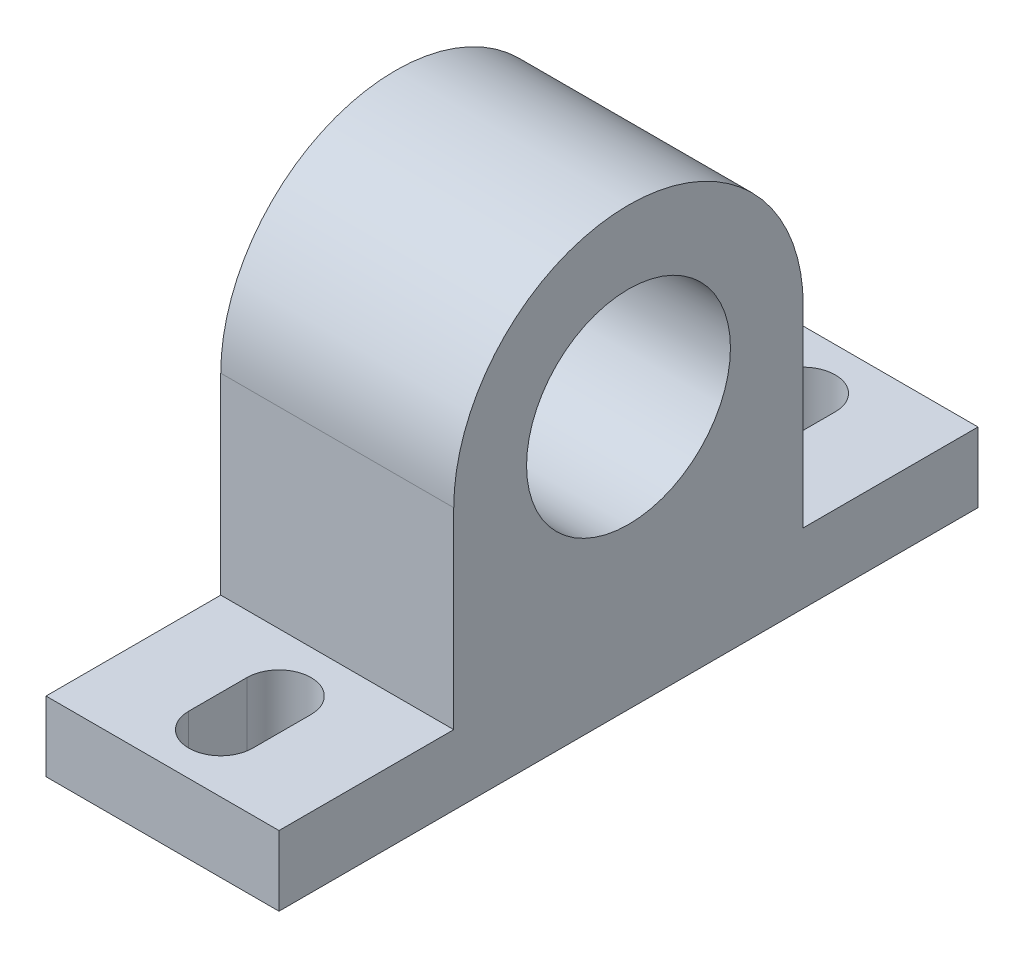
ISO-10303-21;
HEADER;
FILE_DESCRIPTION(('STEP AP214'),'2;1');
FILE_NAME('part.step','',(''),(''),'','','');
FILE_SCHEMA(('AUTOMOTIVE_DESIGN { 1 0 10303 214 1 1 1 1 }'));
ENDSEC;
DATA;
#1=APPLICATION_CONTEXT('core data for automotive mechanical design processes');
#2=APPLICATION_PROTOCOL_DEFINITION('international standard','automotive_design',2000,#1);
#3=PRODUCT_CONTEXT('',#1,'mechanical');
#4=PRODUCT('Part','Part','',(#3));
#5=PRODUCT_RELATED_PRODUCT_CATEGORY('part','',(#4));
#6=PRODUCT_DEFINITION_FORMATION('','',#4);
#7=PRODUCT_DEFINITION_CONTEXT('part definition',#1,'design');
#8=PRODUCT_DEFINITION('design','',#6,#7);
#9=PRODUCT_DEFINITION_SHAPE('','',#8);
#10=(LENGTH_UNIT() NAMED_UNIT(*) SI_UNIT(.MILLI.,.METRE.));
#11=(NAMED_UNIT(*) PLANE_ANGLE_UNIT() SI_UNIT($,.RADIAN.));
#12=(NAMED_UNIT(*) SI_UNIT($,.STERADIAN.) SOLID_ANGLE_UNIT());
#13=UNCERTAINTY_MEASURE_WITH_UNIT(LENGTH_MEASURE(1.E-05),#10,'distance_accuracy_value','');
#14=(GEOMETRIC_REPRESENTATION_CONTEXT(3) GLOBAL_UNCERTAINTY_ASSIGNED_CONTEXT((#13)) GLOBAL_UNIT_ASSIGNED_CONTEXT((#10,
#11,#12)) REPRESENTATION_CONTEXT('',''));
#15=CARTESIAN_POINT('',(0.,0.,0.));
#16=DIRECTION('',(0.,0.,1.));
#17=DIRECTION('',(1.,0.,0.));
#18=AXIS2_PLACEMENT_3D('',#15,#16,#17);
#19=CARTESIAN_POINT('',(0.,12.,0.));
#20=DIRECTION('',(0.,-1.,0.));
#21=DIRECTION('',(0.,0.,-1.));
#22=AXIS2_PLACEMENT_3D('',#19,#20,#21);
#23=PLANE('',#22);
#24=DIRECTION('',(0.,0.,1.));
#25=VECTOR('',#24,1.);
#26=CARTESIAN_POINT('',(-5.5,12.,-40.));
#27=LINE('',#26,#25);
#28=CARTESIAN_POINT('',(-5.5,12.,-50.));
#29=VERTEX_POINT('',#28);
#30=CARTESIAN_POINT('',(-5.5,12.,-40.));
#31=VERTEX_POINT('',#30);
#32=EDGE_CURVE('E241',#29,#31,#27,.T.);
#33=ORIENTED_EDGE('',*,*,#32,.F.);
#34=CARTESIAN_POINT('',(0.,12.,-50.));
#35=DIRECTION('',(0.,1.,0.));
#36=DIRECTION('',(0.,0.,-1.));
#37=AXIS2_PLACEMENT_3D('',#34,#35,#36);
#38=CIRCLE('',#37,5.5);
#39=CARTESIAN_POINT('',(5.5,12.,-50.));
#40=VERTEX_POINT('',#39);
#41=EDGE_CURVE('E69',#40,#29,#38,.T.);
#42=ORIENTED_EDGE('',*,*,#41,.F.);
#43=DIRECTION('',(0.,0.,-1.));
#44=VECTOR('',#43,1.);
#45=CARTESIAN_POINT('',(5.5,12.,-50.));
#46=LINE('',#45,#44);
#47=CARTESIAN_POINT('',(5.5,12.,-40.));
#48=VERTEX_POINT('',#47);
#49=EDGE_CURVE('E232',#48,#40,#46,.T.);
#50=ORIENTED_EDGE('',*,*,#49,.F.);
#51=CARTESIAN_POINT('',(0.,12.,-40.));
#52=DIRECTION('',(0.,1.,0.));
#53=DIRECTION('',(0.,0.,-1.));
#54=AXIS2_PLACEMENT_3D('',#51,#52,#53);
#55=CIRCLE('',#54,5.5);
#56=EDGE_CURVE('E236',#31,#48,#55,.T.);
#57=ORIENTED_EDGE('',*,*,#56,.F.);
#58=EDGE_LOOP('',(#33,#42,#50,#57));
#59=FACE_BOUND('',#58,.T.);
#60=DIRECTION('',(-1.,0.,0.));
#61=VECTOR('',#60,1.);
#62=CARTESIAN_POINT('',(0.,12.,-30.));
#63=LINE('',#62,#61);
#64=CARTESIAN_POINT('',(20.,12.,-30.));
#65=VERTEX_POINT('',#64);
#66=CARTESIAN_POINT('',(-20.,12.,-30.));
#67=VERTEX_POINT('',#66);
#68=EDGE_CURVE('E11',#65,#67,#63,.T.);
#69=ORIENTED_EDGE('',*,*,#68,.F.);
#70=DIRECTION('',(0.,0.,-1.));
#71=VECTOR('',#70,1.);
#72=CARTESIAN_POINT('',(20.,12.,-60.));
#73=LINE('',#72,#71);
#74=CARTESIAN_POINT('',(20.,12.,-60.));
#75=VERTEX_POINT('',#74);
#76=EDGE_CURVE('E301',#65,#75,#73,.T.);
#77=ORIENTED_EDGE('',*,*,#76,.T.);
#78=DIRECTION('',(-1.,0.,0.));
#79=VECTOR('',#78,1.);
#80=CARTESIAN_POINT('',(-20.,12.,-60.));
#81=LINE('',#80,#79);
#82=CARTESIAN_POINT('',(-20.,12.,-60.));
#83=VERTEX_POINT('',#82);
#84=EDGE_CURVE('E305',#75,#83,#81,.T.);
#85=ORIENTED_EDGE('',*,*,#84,.T.);
#86=DIRECTION('',(0.,0.,1.));
#87=VECTOR('',#86,1.);
#88=CARTESIAN_POINT('',(-20.,12.,60.));
#89=LINE('',#88,#87);
#90=EDGE_CURVE('E294',#83,#67,#89,.T.);
#91=ORIENTED_EDGE('',*,*,#90,.T.);
#92=EDGE_LOOP('',(#69,#77,#85,#91));
#93=FACE_BOUND('',#92,.T.);
#94=ADVANCED_FACE('F51',(#59,#93),#23,.F.);
#95=DIRECTION('',(0.,0.,1.));
#96=VECTOR('',#95,1.);
#97=CARTESIAN_POINT('',(-5.5,12.,50.));
#98=LINE('',#97,#96);
#99=CARTESIAN_POINT('',(-5.5,12.,40.));
#100=VERTEX_POINT('',#99);
#101=CARTESIAN_POINT('',(-5.5,12.,50.));
#102=VERTEX_POINT('',#101);
#103=EDGE_CURVE('E206',#100,#102,#98,.T.);
#104=ORIENTED_EDGE('',*,*,#103,.F.);
#105=CARTESIAN_POINT('',(0.,12.,40.));
#106=DIRECTION('',(0.,1.,0.));
#107=DIRECTION('',(0.,0.,-1.));
#108=AXIS2_PLACEMENT_3D('',#105,#106,#107);
#109=CIRCLE('',#108,5.5);
#110=CARTESIAN_POINT('',(5.5,12.,40.));
#111=VERTEX_POINT('',#110);
#112=EDGE_CURVE('E77',#111,#100,#109,.T.);
#113=ORIENTED_EDGE('',*,*,#112,.F.);
#114=DIRECTION('',(0.,0.,-1.));
#115=VECTOR('',#114,1.);
#116=CARTESIAN_POINT('',(5.5,12.,40.));
#117=LINE('',#116,#115);
#118=CARTESIAN_POINT('',(5.5,12.,50.));
#119=VERTEX_POINT('',#118);
#120=EDGE_CURVE('E191',#119,#111,#117,.T.);
#121=ORIENTED_EDGE('',*,*,#120,.F.);
#122=CARTESIAN_POINT('',(0.,12.,50.));
#123=DIRECTION('',(0.,1.,0.));
#124=DIRECTION('',(0.,0.,-1.));
#125=AXIS2_PLACEMENT_3D('',#122,#123,#124);
#126=CIRCLE('',#125,5.5);
#127=EDGE_CURVE('E197',#102,#119,#126,.T.);
#128=ORIENTED_EDGE('',*,*,#127,.F.);
#129=EDGE_LOOP('',(#104,#113,#121,#128));
#130=FACE_BOUND('',#129,.T.);
#131=DIRECTION('',(1.,0.,0.));
#132=VECTOR('',#131,1.);
#133=CARTESIAN_POINT('',(0.,12.,30.));
#134=LINE('',#133,#132);
#135=CARTESIAN_POINT('',(-20.,12.,30.));
#136=VERTEX_POINT('',#135);
#137=CARTESIAN_POINT('',(20.,12.,30.));
#138=VERTEX_POINT('',#137);
#139=EDGE_CURVE('E62',#136,#138,#134,.T.);
#140=ORIENTED_EDGE('',*,*,#139,.F.);
#141=CARTESIAN_POINT('',(-20.,12.,60.));
#142=VERTEX_POINT('',#141);
#143=EDGE_CURVE('E298',#136,#142,#89,.T.);
#144=ORIENTED_EDGE('',*,*,#143,.T.);
#145=DIRECTION('',(1.,0.,0.));
#146=VECTOR('',#145,1.);
#147=CARTESIAN_POINT('',(20.,12.,60.));
#148=LINE('',#147,#146);
#149=CARTESIAN_POINT('',(20.,12.,60.));
#150=VERTEX_POINT('',#149);
#151=EDGE_CURVE('E297',#142,#150,#148,.T.);
#152=ORIENTED_EDGE('',*,*,#151,.T.);
#153=EDGE_CURVE('E302',#150,#138,#73,.T.);
#154=ORIENTED_EDGE('',*,*,#153,.T.);
#155=EDGE_LOOP('',(#140,#144,#152,#154));
#156=FACE_BOUND('',#155,.T.);
#157=ADVANCED_FACE('F383',(#130,#156),#23,.F.);
#158=CARTESIAN_POINT('',(-20.,12.,60.));
#159=DIRECTION('',(1.,0.,0.));
#160=DIRECTION('',(0.,0.,-1.));
#161=AXIS2_PLACEMENT_3D('',#158,#159,#160);
#162=PLANE('',#161);
#163=CARTESIAN_POINT('',(-20.,45.,0.));
#164=DIRECTION('',(1.,0.,0.));
#165=DIRECTION('',(0.,0.,-1.));
#166=AXIS2_PLACEMENT_3D('',#163,#164,#165);
#167=CIRCLE('',#166,17.5);
#168=CARTESIAN_POINT('',(-20.,45.,-17.5));
#169=VERTEX_POINT('',#168);
#170=EDGE_CURVE('E261',#169,#169,#167,.T.);
#171=ORIENTED_EDGE('',*,*,#170,.T.);
#172=EDGE_LOOP('',(#171));
#173=FACE_BOUND('',#172,.T.);
#174=DIRECTION('',(0.,1.,0.));
#175=VECTOR('',#174,1.);
#176=CARTESIAN_POINT('',(-20.,10.,-30.));
#177=LINE('',#176,#175);
#178=CARTESIAN_POINT('',(-20.,45.,-30.));
#179=VERTEX_POINT('',#178);
#180=EDGE_CURVE('E265',#67,#179,#177,.T.);
#181=ORIENTED_EDGE('',*,*,#180,.F.);
#182=ORIENTED_EDGE('',*,*,#90,.F.);
#183=DIRECTION('',(0.,-1.,0.));
#184=VECTOR('',#183,1.);
#185=CARTESIAN_POINT('',(-20.,12.,-60.));
#186=LINE('',#185,#184);
#187=CARTESIAN_POINT('',(-20.,0.,-60.));
#188=VERTEX_POINT('',#187);
#189=EDGE_CURVE('E308',#83,#188,#186,.T.);
#190=ORIENTED_EDGE('',*,*,#189,.T.);
#191=DIRECTION('',(0.,0.,1.));
#192=VECTOR('',#191,1.);
#193=CARTESIAN_POINT('',(-20.,0.,60.));
#194=LINE('',#193,#192);
#195=CARTESIAN_POINT('',(-20.,0.,60.));
#196=VERTEX_POINT('',#195);
#197=EDGE_CURVE('E293',#188,#196,#194,.T.);
#198=ORIENTED_EDGE('',*,*,#197,.T.);
#199=DIRECTION('',(0.,-1.,0.));
#200=VECTOR('',#199,1.);
#201=CARTESIAN_POINT('',(-20.,12.,60.));
#202=LINE('',#201,#200);
#203=EDGE_CURVE('E331',#142,#196,#202,.T.);
#204=ORIENTED_EDGE('',*,*,#203,.F.);
#205=ORIENTED_EDGE('',*,*,#143,.F.);
#206=DIRECTION('',(0.,-1.,0.));
#207=VECTOR('',#206,1.);
#208=CARTESIAN_POINT('',(-20.,45.,30.));
#209=LINE('',#208,#207);
#210=CARTESIAN_POINT('',(-20.,45.,30.));
#211=VERTEX_POINT('',#210);
#212=EDGE_CURVE('E270',#211,#136,#209,.T.);
#213=ORIENTED_EDGE('',*,*,#212,.F.);
#214=CARTESIAN_POINT('',(-20.,45.,0.));
#215=DIRECTION('',(1.,0.,0.));
#216=DIRECTION('',(0.,0.,-1.));
#217=AXIS2_PLACEMENT_3D('',#214,#215,#216);
#218=CIRCLE('',#217,30.);
#219=EDGE_CURVE('E280',#179,#211,#218,.T.);
#220=ORIENTED_EDGE('',*,*,#219,.F.);
#221=EDGE_LOOP('',(#181,#182,#190,#198,#204,#205,#213,#220));
#222=FACE_BOUND('',#221,.T.);
#223=ADVANCED_FACE('F54',(#173,#222),#162,.F.);
#224=CARTESIAN_POINT('',(20.,12.,60.));
#225=DIRECTION('',(0.,0.,-1.));
#226=DIRECTION('',(-1.,0.,0.));
#227=AXIS2_PLACEMENT_3D('',#224,#225,#226);
#228=PLANE('',#227);
#229=DIRECTION('',(1.,0.,0.));
#230=VECTOR('',#229,1.);
#231=CARTESIAN_POINT('',(20.,0.,60.));
#232=LINE('',#231,#230);
#233=CARTESIAN_POINT('',(20.,0.,60.));
#234=VERTEX_POINT('',#233);
#235=EDGE_CURVE('E311',#196,#234,#232,.T.);
#236=ORIENTED_EDGE('',*,*,#235,.T.);
#237=DIRECTION('',(0.,-1.,0.));
#238=VECTOR('',#237,1.);
#239=CARTESIAN_POINT('',(20.,12.,60.));
#240=LINE('',#239,#238);
#241=EDGE_CURVE('E327',#150,#234,#240,.T.);
#242=ORIENTED_EDGE('',*,*,#241,.F.);
#243=ORIENTED_EDGE('',*,*,#151,.F.);
#244=ORIENTED_EDGE('',*,*,#203,.T.);
#245=EDGE_LOOP('',(#236,#242,#243,#244));
#246=FACE_BOUND('',#245,.T.);
#247=ADVANCED_FACE('F398',(#246),#228,.F.);
#248=CARTESIAN_POINT('',(20.,12.,-60.));
#249=DIRECTION('',(-1.,0.,0.));
#250=DIRECTION('',(0.,0.,1.));
#251=AXIS2_PLACEMENT_3D('',#248,#249,#250);
#252=PLANE('',#251);
#253=CARTESIAN_POINT('',(20.,45.,0.));
#254=DIRECTION('',(-1.,0.,0.));
#255=DIRECTION('',(0.,0.,1.));
#256=AXIS2_PLACEMENT_3D('',#253,#254,#255);
#257=CIRCLE('',#256,17.5);
#258=CARTESIAN_POINT('',(20.,45.,17.5));
#259=VERTEX_POINT('',#258);
#260=EDGE_CURVE('E56',#259,#259,#257,.T.);
#261=ORIENTED_EDGE('',*,*,#260,.T.);
#262=EDGE_LOOP('',(#261));
#263=FACE_BOUND('',#262,.T.);
#264=ORIENTED_EDGE('',*,*,#76,.F.);
#265=DIRECTION('',(0.,1.,0.));
#266=VECTOR('',#265,1.);
#267=CARTESIAN_POINT('',(20.,10.,-30.));
#268=LINE('',#267,#266);
#269=CARTESIAN_POINT('',(20.,45.,-30.));
#270=VERTEX_POINT('',#269);
#271=EDGE_CURVE('E266',#65,#270,#268,.T.);
#272=ORIENTED_EDGE('',*,*,#271,.T.);
#273=CARTESIAN_POINT('',(20.,45.,0.));
#274=DIRECTION('',(1.,0.,0.));
#275=DIRECTION('',(0.,0.,-1.));
#276=AXIS2_PLACEMENT_3D('',#273,#274,#275);
#277=CIRCLE('',#276,30.);
#278=CARTESIAN_POINT('',(20.,45.,30.));
#279=VERTEX_POINT('',#278);
#280=EDGE_CURVE('E269',#270,#279,#277,.T.);
#281=ORIENTED_EDGE('',*,*,#280,.T.);
#282=DIRECTION('',(0.,-1.,0.));
#283=VECTOR('',#282,1.);
#284=CARTESIAN_POINT('',(20.,45.,30.));
#285=LINE('',#284,#283);
#286=EDGE_CURVE('E273',#279,#138,#285,.T.);
#287=ORIENTED_EDGE('',*,*,#286,.T.);
#288=ORIENTED_EDGE('',*,*,#153,.F.);
#289=ORIENTED_EDGE('',*,*,#241,.T.);
#290=DIRECTION('',(0.,0.,-1.));
#291=VECTOR('',#290,1.);
#292=CARTESIAN_POINT('',(20.,0.,-60.));
#293=LINE('',#292,#291);
#294=CARTESIAN_POINT('',(20.,0.,-60.));
#295=VERTEX_POINT('',#294);
#296=EDGE_CURVE('E314',#234,#295,#293,.T.);
#297=ORIENTED_EDGE('',*,*,#296,.T.);
#298=DIRECTION('',(0.,-1.,0.));
#299=VECTOR('',#298,1.);
#300=CARTESIAN_POINT('',(20.,12.,-60.));
#301=LINE('',#300,#299);
#302=EDGE_CURVE('E323',#75,#295,#301,.T.);
#303=ORIENTED_EDGE('',*,*,#302,.F.);
#304=EDGE_LOOP('',(#264,#272,#281,#287,#288,#289,#297,#303));
#305=FACE_BOUND('',#304,.T.);
#306=ADVANCED_FACE('F346',(#263,#305),#252,.F.);
#307=CARTESIAN_POINT('',(-20.,12.,-60.));
#308=DIRECTION('',(0.,0.,1.));
#309=DIRECTION('',(1.,0.,0.));
#310=AXIS2_PLACEMENT_3D('',#307,#308,#309);
#311=PLANE('',#310);
#312=DIRECTION('',(-1.,0.,0.));
#313=VECTOR('',#312,1.);
#314=CARTESIAN_POINT('',(-20.,0.,-60.));
#315=LINE('',#314,#313);
#316=EDGE_CURVE('E317',#295,#188,#315,.T.);
#317=ORIENTED_EDGE('',*,*,#316,.T.);
#318=ORIENTED_EDGE('',*,*,#189,.F.);
#319=ORIENTED_EDGE('',*,*,#84,.F.);
#320=ORIENTED_EDGE('',*,*,#302,.T.);
#321=EDGE_LOOP('',(#317,#318,#319,#320));
#322=FACE_BOUND('',#321,.T.);
#323=ADVANCED_FACE('F367',(#322),#311,.F.);
#324=CARTESIAN_POINT('',(0.,0.,0.));
#325=DIRECTION('',(0.,-1.,0.));
#326=DIRECTION('',(0.,0.,-1.));
#327=AXIS2_PLACEMENT_3D('',#324,#325,#326);
#328=PLANE('',#327);
#329=CARTESIAN_POINT('',(0.,0.,40.));
#330=DIRECTION('',(0.,1.,0.));
#331=DIRECTION('',(0.,0.,-1.));
#332=AXIS2_PLACEMENT_3D('',#329,#330,#331);
#333=CIRCLE('',#332,5.5);
#334=CARTESIAN_POINT('',(5.5,0.,40.));
#335=VERTEX_POINT('',#334);
#336=CARTESIAN_POINT('',(-5.5,0.,40.));
#337=VERTEX_POINT('',#336);
#338=EDGE_CURVE('E169',#335,#337,#333,.T.);
#339=ORIENTED_EDGE('',*,*,#338,.T.);
#340=DIRECTION('',(0.,0.,1.));
#341=VECTOR('',#340,1.);
#342=CARTESIAN_POINT('',(-5.5,0.,50.));
#343=LINE('',#342,#341);
#344=CARTESIAN_POINT('',(-5.5,0.,50.));
#345=VERTEX_POINT('',#344);
#346=EDGE_CURVE('E180',#337,#345,#343,.T.);
#347=ORIENTED_EDGE('',*,*,#346,.T.);
#348=CARTESIAN_POINT('',(0.,0.,50.));
#349=DIRECTION('',(0.,1.,0.));
#350=DIRECTION('',(0.,0.,-1.));
#351=AXIS2_PLACEMENT_3D('',#348,#349,#350);
#352=CIRCLE('',#351,5.5);
#353=CARTESIAN_POINT('',(5.5,0.,50.));
#354=VERTEX_POINT('',#353);
#355=EDGE_CURVE('E185',#345,#354,#352,.T.);
#356=ORIENTED_EDGE('',*,*,#355,.T.);
#357=DIRECTION('',(0.,0.,-1.));
#358=VECTOR('',#357,1.);
#359=CARTESIAN_POINT('',(5.5,0.,40.));
#360=LINE('',#359,#358);
#361=EDGE_CURVE('E176',#354,#335,#360,.T.);
#362=ORIENTED_EDGE('',*,*,#361,.T.);
#363=EDGE_LOOP('',(#339,#347,#356,#362));
#364=FACE_BOUND('',#363,.T.);
#365=CARTESIAN_POINT('',(0.,0.,-50.));
#366=DIRECTION('',(0.,1.,0.));
#367=DIRECTION('',(0.,0.,-1.));
#368=AXIS2_PLACEMENT_3D('',#365,#366,#367);
#369=CIRCLE('',#368,5.5);
#370=CARTESIAN_POINT('',(5.5,0.,-50.));
#371=VERTEX_POINT('',#370);
#372=CARTESIAN_POINT('',(-5.5,0.,-50.));
#373=VERTEX_POINT('',#372);
#374=EDGE_CURVE('E237',#371,#373,#369,.T.);
#375=ORIENTED_EDGE('',*,*,#374,.T.);
#376=DIRECTION('',(0.,0.,1.));
#377=VECTOR('',#376,1.);
#378=CARTESIAN_POINT('',(-5.5,0.,-40.));
#379=LINE('',#378,#377);
#380=CARTESIAN_POINT('',(-5.5,0.,-40.));
#381=VERTEX_POINT('',#380);
#382=EDGE_CURVE('E254',#373,#381,#379,.T.);
#383=ORIENTED_EDGE('',*,*,#382,.T.);
#384=CARTESIAN_POINT('',(0.,0.,-40.));
#385=DIRECTION('',(0.,1.,0.));
#386=DIRECTION('',(0.,0.,-1.));
#387=AXIS2_PLACEMENT_3D('',#384,#385,#386);
#388=CIRCLE('',#387,5.5);
#389=CARTESIAN_POINT('',(5.5,0.,-40.));
#390=VERTEX_POINT('',#389);
#391=EDGE_CURVE('E250',#381,#390,#388,.T.);
#392=ORIENTED_EDGE('',*,*,#391,.T.);
#393=DIRECTION('',(0.,0.,-1.));
#394=VECTOR('',#393,1.);
#395=CARTESIAN_POINT('',(5.5,0.,-50.));
#396=LINE('',#395,#394);
#397=EDGE_CURVE('E222',#390,#371,#396,.T.);
#398=ORIENTED_EDGE('',*,*,#397,.T.);
#399=EDGE_LOOP('',(#375,#383,#392,#398));
#400=FACE_BOUND('',#399,.T.);
#401=ORIENTED_EDGE('',*,*,#197,.F.);
#402=ORIENTED_EDGE('',*,*,#316,.F.);
#403=ORIENTED_EDGE('',*,*,#296,.F.);
#404=ORIENTED_EDGE('',*,*,#235,.F.);
#405=EDGE_LOOP('',(#401,#402,#403,#404));
#406=FACE_BOUND('',#405,.T.);
#407=ADVANCED_FACE('F187',(#364,#400,#406),#328,.T.);
#408=CARTESIAN_POINT('',(20.,10.,-30.));
#409=DIRECTION('',(0.,0.,1.));
#410=DIRECTION('',(1.,0.,0.));
#411=AXIS2_PLACEMENT_3D('',#408,#409,#410);
#412=PLANE('',#411);
#413=ORIENTED_EDGE('',*,*,#271,.F.);
#414=ORIENTED_EDGE('',*,*,#68,.T.);
#415=ORIENTED_EDGE('',*,*,#180,.T.);
#416=DIRECTION('',(-1.,0.,0.));
#417=VECTOR('',#416,1.);
#418=CARTESIAN_POINT('',(20.,45.,-30.));
#419=LINE('',#418,#417);
#420=EDGE_CURVE('E289',#270,#179,#419,.T.);
#421=ORIENTED_EDGE('',*,*,#420,.F.);
#422=EDGE_LOOP('',(#413,#414,#415,#421));
#423=FACE_BOUND('',#422,.T.);
#424=ADVANCED_FACE('F371',(#423),#412,.F.);
#425=CARTESIAN_POINT('',(20.,45.,30.));
#426=DIRECTION('',(0.,0.,-1.));
#427=DIRECTION('',(-1.,0.,0.));
#428=AXIS2_PLACEMENT_3D('',#425,#426,#427);
#429=PLANE('',#428);
#430=ORIENTED_EDGE('',*,*,#212,.T.);
#431=ORIENTED_EDGE('',*,*,#139,.T.);
#432=ORIENTED_EDGE('',*,*,#286,.F.);
#433=DIRECTION('',(-1.,0.,0.));
#434=VECTOR('',#433,1.);
#435=CARTESIAN_POINT('',(20.,45.,30.));
#436=LINE('',#435,#434);
#437=EDGE_CURVE('E277',#279,#211,#436,.T.);
#438=ORIENTED_EDGE('',*,*,#437,.T.);
#439=EDGE_LOOP('',(#430,#431,#432,#438));
#440=FACE_BOUND('',#439,.T.);
#441=ADVANCED_FACE('F340',(#440),#429,.F.);
#442=CARTESIAN_POINT('',(20.,45.,0.));
#443=DIRECTION('',(-1.,0.,0.));
#444=DIRECTION('',(0.,0.,1.));
#445=AXIS2_PLACEMENT_3D('',#442,#443,#444);
#446=CYLINDRICAL_SURFACE('',#445,30.);
#447=ORIENTED_EDGE('',*,*,#219,.T.);
#448=ORIENTED_EDGE('',*,*,#437,.F.);
#449=ORIENTED_EDGE('',*,*,#280,.F.);
#450=ORIENTED_EDGE('',*,*,#420,.T.);
#451=EDGE_LOOP('',(#447,#448,#449,#450));
#452=FACE_BOUND('',#451,.T.);
#453=ADVANCED_FACE('F352',(#452),#446,.T.);
#454=CARTESIAN_POINT('',(-121.,45.,0.));
#455=DIRECTION('',(1.,0.,0.));
#456=DIRECTION('',(0.,0.,-1.));
#457=AXIS2_PLACEMENT_3D('',#454,#455,#456);
#458=CYLINDRICAL_SURFACE('',#457,17.5);
#459=ORIENTED_EDGE('',*,*,#260,.F.);
#460=EDGE_LOOP('',(#459));
#461=FACE_BOUND('',#460,.T.);
#462=ORIENTED_EDGE('',*,*,#170,.F.);
#463=EDGE_LOOP('',(#462));
#464=FACE_BOUND('',#463,.T.);
#465=ADVANCED_FACE('F411',(#461,#464),#458,.F.);
#466=CARTESIAN_POINT('',(0.,0.,-50.));
#467=DIRECTION('',(0.,1.,0.));
#468=DIRECTION('',(0.,0.,1.));
#469=AXIS2_PLACEMENT_3D('',#466,#467,#468);
#470=CYLINDRICAL_SURFACE('',#469,5.5);
#471=ORIENTED_EDGE('',*,*,#41,.T.);
#472=DIRECTION('',(0.,1.,0.));
#473=VECTOR('',#472,1.);
#474=CARTESIAN_POINT('',(-5.5,0.,-50.));
#475=LINE('',#474,#473);
#476=EDGE_CURVE('E220',#373,#29,#475,.T.);
#477=ORIENTED_EDGE('',*,*,#476,.F.);
#478=ORIENTED_EDGE('',*,*,#374,.F.);
#479=DIRECTION('',(0.,1.,0.));
#480=VECTOR('',#479,1.);
#481=CARTESIAN_POINT('',(5.5,0.,-50.));
#482=LINE('',#481,#480);
#483=EDGE_CURVE('E229',#371,#40,#482,.T.);
#484=ORIENTED_EDGE('',*,*,#483,.T.);
#485=EDGE_LOOP('',(#471,#477,#478,#484));
#486=FACE_BOUND('',#485,.T.);
#487=ADVANCED_FACE('F413',(#486),#470,.F.);
#488=CARTESIAN_POINT('',(5.5,0.,-50.));
#489=DIRECTION('',(1.,0.,0.));
#490=DIRECTION('',(0.,0.,-1.));
#491=AXIS2_PLACEMENT_3D('',#488,#489,#490);
#492=PLANE('',#491);
#493=ORIENTED_EDGE('',*,*,#49,.T.);
#494=ORIENTED_EDGE('',*,*,#483,.F.);
#495=ORIENTED_EDGE('',*,*,#397,.F.);
#496=DIRECTION('',(0.,1.,0.));
#497=VECTOR('',#496,1.);
#498=CARTESIAN_POINT('',(5.5,0.,-40.));
#499=LINE('',#498,#497);
#500=EDGE_CURVE('E226',#390,#48,#499,.T.);
#501=ORIENTED_EDGE('',*,*,#500,.T.);
#502=EDGE_LOOP('',(#493,#494,#495,#501));
#503=FACE_BOUND('',#502,.T.);
#504=ADVANCED_FACE('F419',(#503),#492,.F.);
#505=CARTESIAN_POINT('',(0.,0.,-40.));
#506=DIRECTION('',(0.,1.,0.));
#507=DIRECTION('',(0.,0.,1.));
#508=AXIS2_PLACEMENT_3D('',#505,#506,#507);
#509=CYLINDRICAL_SURFACE('',#508,5.5);
#510=ORIENTED_EDGE('',*,*,#56,.T.);
#511=ORIENTED_EDGE('',*,*,#500,.F.);
#512=ORIENTED_EDGE('',*,*,#391,.F.);
#513=DIRECTION('',(0.,1.,0.));
#514=VECTOR('',#513,1.);
#515=CARTESIAN_POINT('',(-5.5,0.,-40.));
#516=LINE('',#515,#514);
#517=EDGE_CURVE('E223',#381,#31,#516,.T.);
#518=ORIENTED_EDGE('',*,*,#517,.T.);
#519=EDGE_LOOP('',(#510,#511,#512,#518));
#520=FACE_BOUND('',#519,.T.);
#521=ADVANCED_FACE('F431',(#520),#509,.F.);
#522=CARTESIAN_POINT('',(-5.5,0.,-40.));
#523=DIRECTION('',(-1.,0.,0.));
#524=DIRECTION('',(0.,0.,1.));
#525=AXIS2_PLACEMENT_3D('',#522,#523,#524);
#526=PLANE('',#525);
#527=ORIENTED_EDGE('',*,*,#32,.T.);
#528=ORIENTED_EDGE('',*,*,#517,.F.);
#529=ORIENTED_EDGE('',*,*,#382,.F.);
#530=ORIENTED_EDGE('',*,*,#476,.T.);
#531=EDGE_LOOP('',(#527,#528,#529,#530));
#532=FACE_BOUND('',#531,.T.);
#533=ADVANCED_FACE('F436',(#532),#526,.F.);
#534=CARTESIAN_POINT('',(0.,0.,40.));
#535=DIRECTION('',(0.,1.,0.));
#536=DIRECTION('',(0.,0.,1.));
#537=AXIS2_PLACEMENT_3D('',#534,#535,#536);
#538=CYLINDRICAL_SURFACE('',#537,5.5);
#539=ORIENTED_EDGE('',*,*,#112,.T.);
#540=DIRECTION('',(0.,1.,0.));
#541=VECTOR('',#540,1.);
#542=CARTESIAN_POINT('',(-5.5,0.,40.));
#543=LINE('',#542,#541);
#544=EDGE_CURVE('E165',#337,#100,#543,.T.);
#545=ORIENTED_EDGE('',*,*,#544,.F.);
#546=ORIENTED_EDGE('',*,*,#338,.F.);
#547=DIRECTION('',(0.,1.,0.));
#548=VECTOR('',#547,1.);
#549=CARTESIAN_POINT('',(5.5,0.,40.));
#550=LINE('',#549,#548);
#551=EDGE_CURVE('E212',#335,#111,#550,.T.);
#552=ORIENTED_EDGE('',*,*,#551,.T.);
#553=EDGE_LOOP('',(#539,#545,#546,#552));
#554=FACE_BOUND('',#553,.T.);
#555=ADVANCED_FACE('F167',(#554),#538,.F.);
#556=CARTESIAN_POINT('',(5.5,0.,40.));
#557=DIRECTION('',(1.,0.,0.));
#558=DIRECTION('',(0.,0.,-1.));
#559=AXIS2_PLACEMENT_3D('',#556,#557,#558);
#560=PLANE('',#559);
#561=ORIENTED_EDGE('',*,*,#120,.T.);
#562=ORIENTED_EDGE('',*,*,#551,.F.);
#563=ORIENTED_EDGE('',*,*,#361,.F.);
#564=DIRECTION('',(0.,1.,0.));
#565=VECTOR('',#564,1.);
#566=CARTESIAN_POINT('',(5.5,0.,50.));
#567=LINE('',#566,#565);
#568=EDGE_CURVE('E215',#354,#119,#567,.T.);
#569=ORIENTED_EDGE('',*,*,#568,.T.);
#570=EDGE_LOOP('',(#561,#562,#563,#569));
#571=FACE_BOUND('',#570,.T.);
#572=ADVANCED_FACE('F445',(#571),#560,.F.);
#573=CARTESIAN_POINT('',(0.,0.,50.));
#574=DIRECTION('',(0.,1.,0.));
#575=DIRECTION('',(0.,0.,1.));
#576=AXIS2_PLACEMENT_3D('',#573,#574,#575);
#577=CYLINDRICAL_SURFACE('',#576,5.5);
#578=ORIENTED_EDGE('',*,*,#127,.T.);
#579=ORIENTED_EDGE('',*,*,#568,.F.);
#580=ORIENTED_EDGE('',*,*,#355,.F.);
#581=DIRECTION('',(0.,1.,0.));
#582=VECTOR('',#581,1.);
#583=CARTESIAN_POINT('',(-5.5,0.,50.));
#584=LINE('',#583,#582);
#585=EDGE_CURVE('E175',#345,#102,#584,.T.);
#586=ORIENTED_EDGE('',*,*,#585,.T.);
#587=EDGE_LOOP('',(#578,#579,#580,#586));
#588=FACE_BOUND('',#587,.T.);
#589=ADVANCED_FACE('F449',(#588),#577,.F.);
#590=CARTESIAN_POINT('',(-5.5,0.,50.));
#591=DIRECTION('',(-1.,0.,0.));
#592=DIRECTION('',(0.,0.,1.));
#593=AXIS2_PLACEMENT_3D('',#590,#591,#592);
#594=PLANE('',#593);
#595=ORIENTED_EDGE('',*,*,#103,.T.);
#596=ORIENTED_EDGE('',*,*,#585,.F.);
#597=ORIENTED_EDGE('',*,*,#346,.F.);
#598=ORIENTED_EDGE('',*,*,#544,.T.);
#599=EDGE_LOOP('',(#595,#596,#597,#598));
#600=FACE_BOUND('',#599,.T.);
#601=ADVANCED_FACE('F181',(#600),#594,.F.);
#602=CLOSED_SHELL('',(#94,#157,#223,#247,#306,#323,#407,#424,#441,#453,#465,#487,#504,#521,#533,
#555,#572,#589,#601));
#603=MANIFOLD_SOLID_BREP('B2',#602);
#604=ADVANCED_BREP_SHAPE_REPRESENTATION('',(#18,#603),#14);
#605=SHAPE_DEFINITION_REPRESENTATION(#9,#604);
ENDSEC;
END-ISO-10303-21;
